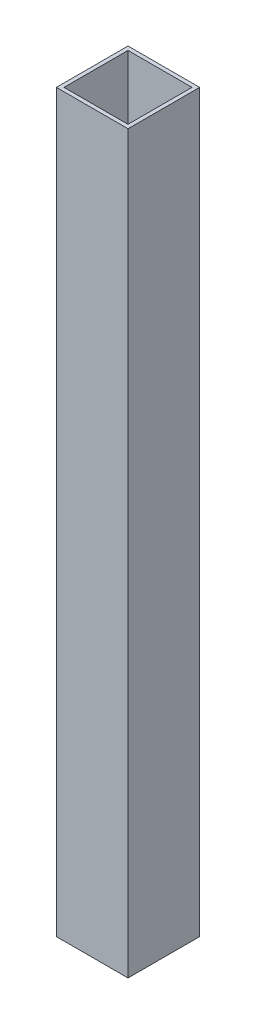
ISO-10303-21;
HEADER;
FILE_DESCRIPTION(('STEP AP214'),'2;1');
FILE_NAME('part.step','',(''),(''),'','','');
FILE_SCHEMA(('AUTOMOTIVE_DESIGN { 1 0 10303 214 1 1 1 1 }'));
ENDSEC;
DATA;
#1=APPLICATION_CONTEXT('core data for automotive mechanical design processes');
#2=APPLICATION_PROTOCOL_DEFINITION('international standard','automotive_design',2000,#1);
#3=PRODUCT_CONTEXT('',#1,'mechanical');
#4=PRODUCT('Part','Part','',(#3));
#5=PRODUCT_RELATED_PRODUCT_CATEGORY('part','',(#4));
#6=PRODUCT_DEFINITION_FORMATION('','',#4);
#7=PRODUCT_DEFINITION_CONTEXT('part definition',#1,'design');
#8=PRODUCT_DEFINITION('design','',#6,#7);
#9=PRODUCT_DEFINITION_SHAPE('','',#8);
#10=(LENGTH_UNIT() NAMED_UNIT(*) SI_UNIT(.MILLI.,.METRE.));
#11=(NAMED_UNIT(*) PLANE_ANGLE_UNIT() SI_UNIT($,.RADIAN.));
#12=(NAMED_UNIT(*) SI_UNIT($,.STERADIAN.) SOLID_ANGLE_UNIT());
#13=UNCERTAINTY_MEASURE_WITH_UNIT(LENGTH_MEASURE(1.E-05),#10,'distance_accuracy_value','');
#14=(GEOMETRIC_REPRESENTATION_CONTEXT(3) GLOBAL_UNCERTAINTY_ASSIGNED_CONTEXT((#13)) GLOBAL_UNIT_ASSIGNED_CONTEXT((#10,
#11,#12)) REPRESENTATION_CONTEXT('',''));
#15=CARTESIAN_POINT('',(0.,0.,0.));
#16=DIRECTION('',(0.,0.,1.));
#17=DIRECTION('',(1.,0.,0.));
#18=AXIS2_PLACEMENT_3D('',#15,#16,#17);
#19=CARTESIAN_POINT('',(0.,154.,0.));
#20=DIRECTION('',(0.,-1.,0.));
#21=DIRECTION('',(0.,0.,-1.));
#22=AXIS2_PLACEMENT_3D('',#19,#20,#21);
#23=PLANE('',#22);
#24=DIRECTION('',(0.,0.,-1.));
#25=VECTOR('',#24,1.);
#26=CARTESIAN_POINT('',(7.5,154.,7.5));
#27=LINE('',#26,#25);
#28=CARTESIAN_POINT('',(7.5,154.,7.5));
#29=VERTEX_POINT('',#28);
#30=CARTESIAN_POINT('',(7.5,154.,-7.5));
#31=VERTEX_POINT('',#30);
#32=EDGE_CURVE('E133',#29,#31,#27,.T.);
#33=ORIENTED_EDGE('',*,*,#32,.T.);
#34=DIRECTION('',(-1.,0.,0.));
#35=VECTOR('',#34,1.);
#36=CARTESIAN_POINT('',(-7.5,154.,-7.5));
#37=LINE('',#36,#35);
#38=CARTESIAN_POINT('',(-7.5,154.,-7.5));
#39=VERTEX_POINT('',#38);
#40=EDGE_CURVE('E136',#31,#39,#37,.T.);
#41=ORIENTED_EDGE('',*,*,#40,.T.);
#42=DIRECTION('',(0.,0.,1.));
#43=VECTOR('',#42,1.);
#44=CARTESIAN_POINT('',(-7.5,154.,7.5));
#45=LINE('',#44,#43);
#46=CARTESIAN_POINT('',(-7.5,154.,7.5));
#47=VERTEX_POINT('',#46);
#48=EDGE_CURVE('E139',#39,#47,#45,.T.);
#49=ORIENTED_EDGE('',*,*,#48,.T.);
#50=DIRECTION('',(1.,0.,0.));
#51=VECTOR('',#50,1.);
#52=CARTESIAN_POINT('',(-7.5,154.,7.5));
#53=LINE('',#52,#51);
#54=EDGE_CURVE('E141',#47,#29,#53,.T.);
#55=ORIENTED_EDGE('',*,*,#54,.T.);
#56=EDGE_LOOP('',(#33,#41,#49,#55));
#57=FACE_BOUND('',#56,.T.);
#58=DIRECTION('',(0.,0.,1.));
#59=VECTOR('',#58,1.);
#60=CARTESIAN_POINT('',(-6.7,154.,6.7));
#61=LINE('',#60,#59);
#62=CARTESIAN_POINT('',(-6.7,154.,-6.7));
#63=VERTEX_POINT('',#62);
#64=CARTESIAN_POINT('',(-6.7,154.,6.7));
#65=VERTEX_POINT('',#64);
#66=EDGE_CURVE('E97',#63,#65,#61,.T.);
#67=ORIENTED_EDGE('',*,*,#66,.F.);
#68=DIRECTION('',(-1.,0.,0.));
#69=VECTOR('',#68,1.);
#70=CARTESIAN_POINT('',(-6.7,154.,-6.7));
#71=LINE('',#70,#69);
#72=CARTESIAN_POINT('',(6.7,154.,-6.7));
#73=VERTEX_POINT('',#72);
#74=EDGE_CURVE('E119',#73,#63,#71,.T.);
#75=ORIENTED_EDGE('',*,*,#74,.F.);
#76=DIRECTION('',(0.,0.,-1.));
#77=VECTOR('',#76,1.);
#78=CARTESIAN_POINT('',(6.7,154.,6.7));
#79=LINE('',#78,#77);
#80=CARTESIAN_POINT('',(6.7,154.,6.7));
#81=VERTEX_POINT('',#80);
#82=EDGE_CURVE('E117',#81,#73,#79,.T.);
#83=ORIENTED_EDGE('',*,*,#82,.F.);
#84=DIRECTION('',(1.,0.,0.));
#85=VECTOR('',#84,1.);
#86=CARTESIAN_POINT('',(-6.7,154.,6.7));
#87=LINE('',#86,#85);
#88=EDGE_CURVE('E105',#65,#81,#87,.T.);
#89=ORIENTED_EDGE('',*,*,#88,.F.);
#90=EDGE_LOOP('',(#67,#75,#83,#89));
#91=FACE_BOUND('',#90,.T.);
#92=ADVANCED_FACE('F32',(#57,#91),#23,.F.);
#93=CARTESIAN_POINT('',(0.,0.,0.));
#94=DIRECTION('',(0.,-1.,0.));
#95=DIRECTION('',(0.,0.,-1.));
#96=AXIS2_PLACEMENT_3D('',#93,#94,#95);
#97=PLANE('',#96);
#98=DIRECTION('',(0.,0.,-1.));
#99=VECTOR('',#98,1.);
#100=CARTESIAN_POINT('',(7.5,0.,7.5));
#101=LINE('',#100,#99);
#102=CARTESIAN_POINT('',(7.5,0.,7.5));
#103=VERTEX_POINT('',#102);
#104=CARTESIAN_POINT('',(7.5,0.,-7.5));
#105=VERTEX_POINT('',#104);
#106=EDGE_CURVE('E113',#103,#105,#101,.T.);
#107=ORIENTED_EDGE('',*,*,#106,.F.);
#108=DIRECTION('',(1.,0.,0.));
#109=VECTOR('',#108,1.);
#110=CARTESIAN_POINT('',(-7.5,0.,7.5));
#111=LINE('',#110,#109);
#112=CARTESIAN_POINT('',(-7.5,0.,7.5));
#113=VERTEX_POINT('',#112);
#114=EDGE_CURVE('E137',#113,#103,#111,.T.);
#115=ORIENTED_EDGE('',*,*,#114,.F.);
#116=DIRECTION('',(0.,0.,1.));
#117=VECTOR('',#116,1.);
#118=CARTESIAN_POINT('',(-7.5,0.,7.5));
#119=LINE('',#118,#117);
#120=CARTESIAN_POINT('',(-7.5,0.,-7.5));
#121=VERTEX_POINT('',#120);
#122=EDGE_CURVE('E148',#121,#113,#119,.T.);
#123=ORIENTED_EDGE('',*,*,#122,.F.);
#124=DIRECTION('',(-1.,0.,0.));
#125=VECTOR('',#124,1.);
#126=CARTESIAN_POINT('',(-7.5,0.,-7.5));
#127=LINE('',#126,#125);
#128=EDGE_CURVE('E146',#105,#121,#127,.T.);
#129=ORIENTED_EDGE('',*,*,#128,.F.);
#130=EDGE_LOOP('',(#107,#115,#123,#129));
#131=FACE_BOUND('',#130,.T.);
#132=DIRECTION('',(-1.,0.,0.));
#133=VECTOR('',#132,1.);
#134=CARTESIAN_POINT('',(-6.7,0.,-6.7));
#135=LINE('',#134,#133);
#136=CARTESIAN_POINT('',(6.7,0.,-6.7));
#137=VERTEX_POINT('',#136);
#138=CARTESIAN_POINT('',(-6.7,0.,-6.7));
#139=VERTEX_POINT('',#138);
#140=EDGE_CURVE('E106',#137,#139,#135,.T.);
#141=ORIENTED_EDGE('',*,*,#140,.T.);
#142=DIRECTION('',(0.,0.,1.));
#143=VECTOR('',#142,1.);
#144=CARTESIAN_POINT('',(-6.7,0.,6.7));
#145=LINE('',#144,#143);
#146=CARTESIAN_POINT('',(-6.7,0.,6.7));
#147=VERTEX_POINT('',#146);
#148=EDGE_CURVE('E55',#139,#147,#145,.T.);
#149=ORIENTED_EDGE('',*,*,#148,.T.);
#150=DIRECTION('',(1.,0.,0.));
#151=VECTOR('',#150,1.);
#152=CARTESIAN_POINT('',(-6.7,0.,6.7));
#153=LINE('',#152,#151);
#154=CARTESIAN_POINT('',(6.7,0.,6.7));
#155=VERTEX_POINT('',#154);
#156=EDGE_CURVE('E112',#147,#155,#153,.T.);
#157=ORIENTED_EDGE('',*,*,#156,.T.);
#158=DIRECTION('',(0.,0.,-1.));
#159=VECTOR('',#158,1.);
#160=CARTESIAN_POINT('',(6.7,0.,6.7));
#161=LINE('',#160,#159);
#162=EDGE_CURVE('E125',#155,#137,#161,.T.);
#163=ORIENTED_EDGE('',*,*,#162,.T.);
#164=EDGE_LOOP('',(#141,#149,#157,#163));
#165=FACE_BOUND('',#164,.T.);
#166=ADVANCED_FACE('F166',(#131,#165),#97,.T.);
#167=CARTESIAN_POINT('',(7.5,154.,7.5));
#168=DIRECTION('',(-1.,0.,0.));
#169=DIRECTION('',(0.,0.,1.));
#170=AXIS2_PLACEMENT_3D('',#167,#168,#169);
#171=PLANE('',#170);
#172=ORIENTED_EDGE('',*,*,#106,.T.);
#173=DIRECTION('',(0.,-1.,0.));
#174=VECTOR('',#173,1.);
#175=CARTESIAN_POINT('',(7.5,154.,-7.5));
#176=LINE('',#175,#174);
#177=EDGE_CURVE('E11',#31,#105,#176,.T.);
#178=ORIENTED_EDGE('',*,*,#177,.F.);
#179=ORIENTED_EDGE('',*,*,#32,.F.);
#180=DIRECTION('',(0.,-1.,0.));
#181=VECTOR('',#180,1.);
#182=CARTESIAN_POINT('',(7.5,154.,7.5));
#183=LINE('',#182,#181);
#184=EDGE_CURVE('E143',#29,#103,#183,.T.);
#185=ORIENTED_EDGE('',*,*,#184,.T.);
#186=EDGE_LOOP('',(#172,#178,#179,#185));
#187=FACE_BOUND('',#186,.T.);
#188=ADVANCED_FACE('F34',(#187),#171,.F.);
#189=CARTESIAN_POINT('',(-7.5,154.,-7.5));
#190=DIRECTION('',(0.,0.,1.));
#191=DIRECTION('',(1.,0.,0.));
#192=AXIS2_PLACEMENT_3D('',#189,#190,#191);
#193=PLANE('',#192);
#194=ORIENTED_EDGE('',*,*,#128,.T.);
#195=DIRECTION('',(0.,-1.,0.));
#196=VECTOR('',#195,1.);
#197=CARTESIAN_POINT('',(-7.5,154.,-7.5));
#198=LINE('',#197,#196);
#199=EDGE_CURVE('E40',#39,#121,#198,.T.);
#200=ORIENTED_EDGE('',*,*,#199,.F.);
#201=ORIENTED_EDGE('',*,*,#40,.F.);
#202=ORIENTED_EDGE('',*,*,#177,.T.);
#203=EDGE_LOOP('',(#194,#200,#201,#202));
#204=FACE_BOUND('',#203,.T.);
#205=ADVANCED_FACE('F176',(#204),#193,.F.);
#206=CARTESIAN_POINT('',(-7.5,154.,7.5));
#207=DIRECTION('',(1.,0.,0.));
#208=DIRECTION('',(0.,0.,-1.));
#209=AXIS2_PLACEMENT_3D('',#206,#207,#208);
#210=PLANE('',#209);
#211=ORIENTED_EDGE('',*,*,#122,.T.);
#212=DIRECTION('',(0.,-1.,0.));
#213=VECTOR('',#212,1.);
#214=CARTESIAN_POINT('',(-7.5,154.,7.5));
#215=LINE('',#214,#213);
#216=EDGE_CURVE('E153',#47,#113,#215,.T.);
#217=ORIENTED_EDGE('',*,*,#216,.F.);
#218=ORIENTED_EDGE('',*,*,#48,.F.);
#219=ORIENTED_EDGE('',*,*,#199,.T.);
#220=EDGE_LOOP('',(#211,#217,#218,#219));
#221=FACE_BOUND('',#220,.T.);
#222=ADVANCED_FACE('F160',(#221),#210,.F.);
#223=CARTESIAN_POINT('',(-7.5,154.,7.5));
#224=DIRECTION('',(0.,0.,-1.));
#225=DIRECTION('',(-1.,0.,0.));
#226=AXIS2_PLACEMENT_3D('',#223,#224,#225);
#227=PLANE('',#226);
#228=ORIENTED_EDGE('',*,*,#114,.T.);
#229=ORIENTED_EDGE('',*,*,#184,.F.);
#230=ORIENTED_EDGE('',*,*,#54,.F.);
#231=ORIENTED_EDGE('',*,*,#216,.T.);
#232=EDGE_LOOP('',(#228,#229,#230,#231));
#233=FACE_BOUND('',#232,.T.);
#234=ADVANCED_FACE('F170',(#233),#227,.F.);
#235=CARTESIAN_POINT('',(-6.7,154.,6.7));
#236=DIRECTION('',(1.,0.,0.));
#237=DIRECTION('',(0.,0.,-1.));
#238=AXIS2_PLACEMENT_3D('',#235,#236,#237);
#239=PLANE('',#238);
#240=ORIENTED_EDGE('',*,*,#148,.F.);
#241=DIRECTION('',(0.,-1.,0.));
#242=VECTOR('',#241,1.);
#243=CARTESIAN_POINT('',(-6.7,154.,-6.7));
#244=LINE('',#243,#242);
#245=EDGE_CURVE('E101',#63,#139,#244,.T.);
#246=ORIENTED_EDGE('',*,*,#245,.F.);
#247=ORIENTED_EDGE('',*,*,#66,.T.);
#248=DIRECTION('',(0.,-1.,0.));
#249=VECTOR('',#248,1.);
#250=CARTESIAN_POINT('',(-6.7,154.,6.7));
#251=LINE('',#250,#249);
#252=EDGE_CURVE('E100',#65,#147,#251,.T.);
#253=ORIENTED_EDGE('',*,*,#252,.T.);
#254=EDGE_LOOP('',(#240,#246,#247,#253));
#255=FACE_BOUND('',#254,.T.);
#256=ADVANCED_FACE('F99',(#255),#239,.T.);
#257=CARTESIAN_POINT('',(-6.7,154.,6.7));
#258=DIRECTION('',(0.,0.,-1.));
#259=DIRECTION('',(-1.,0.,0.));
#260=AXIS2_PLACEMENT_3D('',#257,#258,#259);
#261=PLANE('',#260);
#262=ORIENTED_EDGE('',*,*,#156,.F.);
#263=ORIENTED_EDGE('',*,*,#252,.F.);
#264=ORIENTED_EDGE('',*,*,#88,.T.);
#265=DIRECTION('',(0.,-1.,0.));
#266=VECTOR('',#265,1.);
#267=CARTESIAN_POINT('',(6.7,154.,6.7));
#268=LINE('',#267,#266);
#269=EDGE_CURVE('E114',#81,#155,#268,.T.);
#270=ORIENTED_EDGE('',*,*,#269,.T.);
#271=EDGE_LOOP('',(#262,#263,#264,#270));
#272=FACE_BOUND('',#271,.T.);
#273=ADVANCED_FACE('F109',(#272),#261,.T.);
#274=CARTESIAN_POINT('',(6.7,154.,6.7));
#275=DIRECTION('',(-1.,0.,0.));
#276=DIRECTION('',(0.,0.,1.));
#277=AXIS2_PLACEMENT_3D('',#274,#275,#276);
#278=PLANE('',#277);
#279=ORIENTED_EDGE('',*,*,#162,.F.);
#280=ORIENTED_EDGE('',*,*,#269,.F.);
#281=ORIENTED_EDGE('',*,*,#82,.T.);
#282=DIRECTION('',(0.,-1.,0.));
#283=VECTOR('',#282,1.);
#284=CARTESIAN_POINT('',(6.7,154.,-6.7));
#285=LINE('',#284,#283);
#286=EDGE_CURVE('E47',#73,#137,#285,.T.);
#287=ORIENTED_EDGE('',*,*,#286,.T.);
#288=EDGE_LOOP('',(#279,#280,#281,#287));
#289=FACE_BOUND('',#288,.T.);
#290=ADVANCED_FACE('F199',(#289),#278,.T.);
#291=CARTESIAN_POINT('',(-6.7,154.,-6.7));
#292=DIRECTION('',(0.,0.,1.));
#293=DIRECTION('',(1.,0.,0.));
#294=AXIS2_PLACEMENT_3D('',#291,#292,#293);
#295=PLANE('',#294);
#296=ORIENTED_EDGE('',*,*,#140,.F.);
#297=ORIENTED_EDGE('',*,*,#286,.F.);
#298=ORIENTED_EDGE('',*,*,#74,.T.);
#299=ORIENTED_EDGE('',*,*,#245,.T.);
#300=EDGE_LOOP('',(#296,#297,#298,#299));
#301=FACE_BOUND('',#300,.T.);
#302=ADVANCED_FACE('F203',(#301),#295,.T.);
#303=CLOSED_SHELL('',(#92,#166,#188,#205,#222,#234,#256,#273,#290,#302));
#304=MANIFOLD_SOLID_BREP('B2',#303);
#305=ADVANCED_BREP_SHAPE_REPRESENTATION('',(#18,#304),#14);
#306=SHAPE_DEFINITION_REPRESENTATION(#9,#305);
ENDSEC;
END-ISO-10303-21;
